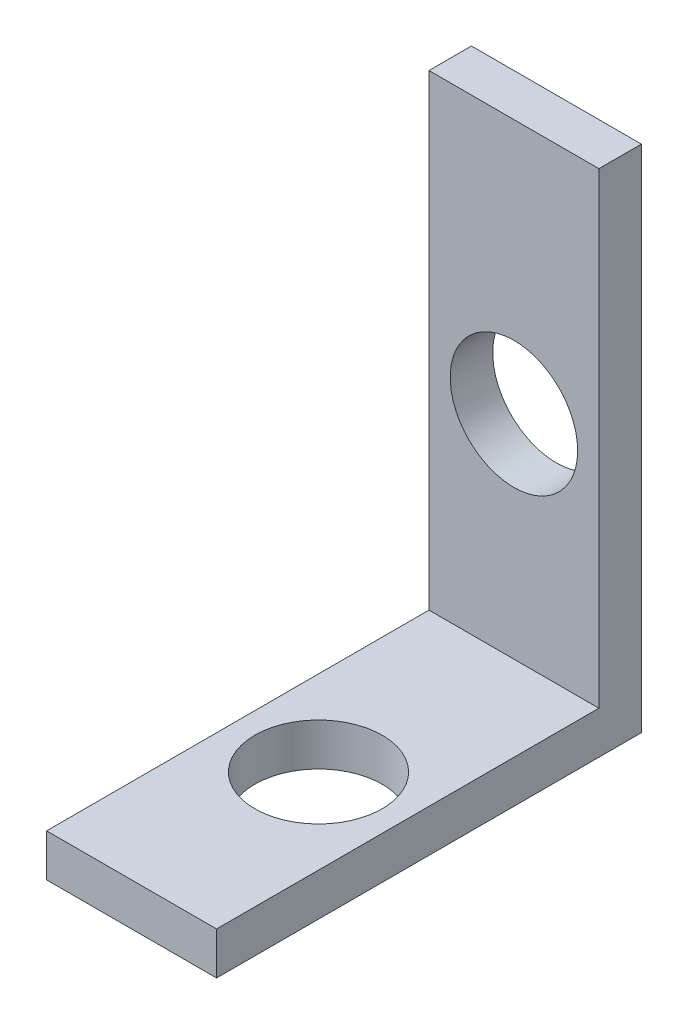
ISO-10303-21;
HEADER;
FILE_DESCRIPTION(('STEP AP214'),'2;1');
FILE_NAME('part.step','',(''),(''),'','','');
FILE_SCHEMA(('AUTOMOTIVE_DESIGN { 1 0 10303 214 1 1 1 1 }'));
ENDSEC;
DATA;
#1=APPLICATION_CONTEXT('core data for automotive mechanical design processes');
#2=APPLICATION_PROTOCOL_DEFINITION('international standard','automotive_design',2000,#1);
#3=PRODUCT_CONTEXT('',#1,'mechanical');
#4=PRODUCT('Part','Part','',(#3));
#5=PRODUCT_RELATED_PRODUCT_CATEGORY('part','',(#4));
#6=PRODUCT_DEFINITION_FORMATION('','',#4);
#7=PRODUCT_DEFINITION_CONTEXT('part definition',#1,'design');
#8=PRODUCT_DEFINITION('design','',#6,#7);
#9=PRODUCT_DEFINITION_SHAPE('','',#8);
#10=(LENGTH_UNIT() NAMED_UNIT(*) SI_UNIT(.MILLI.,.METRE.));
#11=(NAMED_UNIT(*) PLANE_ANGLE_UNIT() SI_UNIT($,.RADIAN.));
#12=(NAMED_UNIT(*) SI_UNIT($,.STERADIAN.) SOLID_ANGLE_UNIT());
#13=UNCERTAINTY_MEASURE_WITH_UNIT(LENGTH_MEASURE(1.E-05),#10,'distance_accuracy_value','');
#14=(GEOMETRIC_REPRESENTATION_CONTEXT(3) GLOBAL_UNCERTAINTY_ASSIGNED_CONTEXT((#13)) GLOBAL_UNIT_ASSIGNED_CONTEXT((#10,
#11,#12)) REPRESENTATION_CONTEXT('',''));
#15=CARTESIAN_POINT('',(0.,0.,0.));
#16=DIRECTION('',(0.,0.,1.));
#17=DIRECTION('',(1.,0.,0.));
#18=AXIS2_PLACEMENT_3D('',#15,#16,#17);
#19=CARTESIAN_POINT('',(-2.,-0.500000000000001,10.));
#20=DIRECTION('',(0.,0.,1.));
#21=DIRECTION('',(1.,0.,0.));
#22=AXIS2_PLACEMENT_3D('',#19,#20,#21);
#23=PLANE('',#22);
#24=DIRECTION('',(0.,-1.,0.));
#25=VECTOR('',#24,1.);
#26=CARTESIAN_POINT('',(2.,-0.500000000000001,10.));
#27=LINE('',#26,#25);
#28=CARTESIAN_POINT('',(2.,0.499999999999999,10.));
#29=VERTEX_POINT('',#28);
#30=CARTESIAN_POINT('',(2.,-0.500000000000001,10.));
#31=VERTEX_POINT('',#30);
#32=EDGE_CURVE('E11',#29,#31,#27,.T.);
#33=ORIENTED_EDGE('',*,*,#32,.F.);
#34=DIRECTION('',(-1.,0.,0.));
#35=VECTOR('',#34,1.);
#36=CARTESIAN_POINT('',(-2.,0.499999999999999,10.));
#37=LINE('',#36,#35);
#38=CARTESIAN_POINT('',(-2.,0.499999999999999,10.));
#39=VERTEX_POINT('',#38);
#40=EDGE_CURVE('E120',#39,#29,#37,.F.);
#41=ORIENTED_EDGE('',*,*,#40,.F.);
#42=DIRECTION('',(0.,-1.,0.));
#43=VECTOR('',#42,1.);
#44=CARTESIAN_POINT('',(-2.,-0.500000000000001,10.));
#45=LINE('',#44,#43);
#46=CARTESIAN_POINT('',(-2.,-0.500000000000001,10.));
#47=VERTEX_POINT('',#46);
#48=EDGE_CURVE('E51',#39,#47,#45,.T.);
#49=ORIENTED_EDGE('',*,*,#48,.T.);
#50=DIRECTION('',(1.,0.,0.));
#51=VECTOR('',#50,1.);
#52=CARTESIAN_POINT('',(-2.,-0.500000000000001,10.));
#53=LINE('',#52,#51);
#54=EDGE_CURVE('E110',#47,#31,#53,.T.);
#55=ORIENTED_EDGE('',*,*,#54,.T.);
#56=EDGE_LOOP('',(#33,#41,#49,#55));
#57=FACE_BOUND('',#56,.T.);
#58=ADVANCED_FACE('F42',(#57),#23,.T.);
#59=CARTESIAN_POINT('',(-2.,-0.500000000000001,10.));
#60=DIRECTION('',(1.,0.,0.));
#61=DIRECTION('',(0.,0.,-1.));
#62=AXIS2_PLACEMENT_3D('',#59,#60,#61);
#63=PLANE('',#62);
#64=ORIENTED_EDGE('',*,*,#48,.F.);
#65=DIRECTION('',(0.,0.,1.));
#66=VECTOR('',#65,1.);
#67=CARTESIAN_POINT('',(-2.,0.499999999999999,10.));
#68=LINE('',#67,#66);
#69=CARTESIAN_POINT('',(-2.,0.499999999999999,0.999999999999999));
#70=VERTEX_POINT('',#69);
#71=EDGE_CURVE('E118',#39,#70,#68,.F.);
#72=ORIENTED_EDGE('',*,*,#71,.T.);
#73=DIRECTION('',(0.,-1.,0.));
#74=VECTOR('',#73,1.);
#75=CARTESIAN_POINT('',(-2.,11.5,1.));
#76=LINE('',#75,#74);
#77=CARTESIAN_POINT('',(-2.,11.5,1.));
#78=VERTEX_POINT('',#77);
#79=EDGE_CURVE('E123',#78,#70,#76,.T.);
#80=ORIENTED_EDGE('',*,*,#79,.F.);
#81=DIRECTION('',(0.,0.,1.));
#82=VECTOR('',#81,1.);
#83=CARTESIAN_POINT('',(-2.,11.5,0.));
#84=LINE('',#83,#82);
#85=CARTESIAN_POINT('',(-2.,11.5,0.));
#86=VERTEX_POINT('',#85);
#87=EDGE_CURVE('E140',#86,#78,#84,.T.);
#88=ORIENTED_EDGE('',*,*,#87,.F.);
#89=DIRECTION('',(0.,-1.,0.));
#90=VECTOR('',#89,1.);
#91=CARTESIAN_POINT('',(-2.,-0.500000000000001,0.));
#92=LINE('',#91,#90);
#93=CARTESIAN_POINT('',(-2.,-0.500000000000001,0.));
#94=VERTEX_POINT('',#93);
#95=EDGE_CURVE('E67',#86,#94,#92,.T.);
#96=ORIENTED_EDGE('',*,*,#95,.T.);
#97=DIRECTION('',(0.,0.,-1.));
#98=VECTOR('',#97,1.);
#99=CARTESIAN_POINT('',(-2.,-0.500000000000001,10.));
#100=LINE('',#99,#98);
#101=EDGE_CURVE('E113',#47,#94,#100,.T.);
#102=ORIENTED_EDGE('',*,*,#101,.F.);
#103=EDGE_LOOP('',(#64,#72,#80,#88,#96,#102));
#104=FACE_BOUND('',#103,.T.);
#105=ADVANCED_FACE('F151',(#104),#63,.F.);
#106=CARTESIAN_POINT('',(-2.,-0.500000000000001,0.));
#107=DIRECTION('',(0.,0.,1.));
#108=DIRECTION('',(1.,0.,0.));
#109=AXIS2_PLACEMENT_3D('',#106,#107,#108);
#110=PLANE('',#109);
#111=CARTESIAN_POINT('',(0.,5.5,0.));
#112=DIRECTION('',(0.,0.,1.));
#113=DIRECTION('',(1.,0.,0.));
#114=AXIS2_PLACEMENT_3D('',#111,#112,#113);
#115=CIRCLE('',#114,1.5);
#116=CARTESIAN_POINT('',(1.5,5.5,0.));
#117=VERTEX_POINT('',#116);
#118=EDGE_CURVE('E180',#117,#117,#115,.F.);
#119=ORIENTED_EDGE('',*,*,#118,.F.);
#120=EDGE_LOOP('',(#119));
#121=FACE_BOUND('',#120,.T.);
#122=ORIENTED_EDGE('',*,*,#95,.F.);
#123=DIRECTION('',(-1.,0.,0.));
#124=VECTOR('',#123,1.);
#125=CARTESIAN_POINT('',(-2.,11.5,0.));
#126=LINE('',#125,#124);
#127=CARTESIAN_POINT('',(2.,11.5,0.));
#128=VERTEX_POINT('',#127);
#129=EDGE_CURVE('E126',#128,#86,#126,.T.);
#130=ORIENTED_EDGE('',*,*,#129,.F.);
#131=DIRECTION('',(0.,-1.,0.));
#132=VECTOR('',#131,1.);
#133=CARTESIAN_POINT('',(2.,-0.500000000000001,0.));
#134=LINE('',#133,#132);
#135=CARTESIAN_POINT('',(2.,-0.500000000000001,0.));
#136=VERTEX_POINT('',#135);
#137=EDGE_CURVE('E46',#128,#136,#134,.T.);
#138=ORIENTED_EDGE('',*,*,#137,.T.);
#139=DIRECTION('',(1.,0.,0.));
#140=VECTOR('',#139,1.);
#141=CARTESIAN_POINT('',(-2.,-0.500000000000001,0.));
#142=LINE('',#141,#140);
#143=EDGE_CURVE('E111',#94,#136,#142,.T.);
#144=ORIENTED_EDGE('',*,*,#143,.F.);
#145=EDGE_LOOP('',(#122,#130,#138,#144));
#146=FACE_BOUND('',#145,.T.);
#147=ADVANCED_FACE('F125',(#121,#146),#110,.F.);
#148=CARTESIAN_POINT('',(2.,-0.500000000000001,10.));
#149=DIRECTION('',(1.,0.,0.));
#150=DIRECTION('',(0.,0.,-1.));
#151=AXIS2_PLACEMENT_3D('',#148,#149,#150);
#152=PLANE('',#151);
#153=DIRECTION('',(0.,0.,1.));
#154=VECTOR('',#153,1.);
#155=CARTESIAN_POINT('',(2.,0.499999999999999,10.));
#156=LINE('',#155,#154);
#157=CARTESIAN_POINT('',(2.,0.499999999999999,1.));
#158=VERTEX_POINT('',#157);
#159=EDGE_CURVE('E104',#29,#158,#156,.F.);
#160=ORIENTED_EDGE('',*,*,#159,.F.);
#161=ORIENTED_EDGE('',*,*,#32,.T.);
#162=DIRECTION('',(0.,0.,-1.));
#163=VECTOR('',#162,1.);
#164=CARTESIAN_POINT('',(2.,-0.500000000000001,10.));
#165=LINE('',#164,#163);
#166=EDGE_CURVE('E102',#31,#136,#165,.T.);
#167=ORIENTED_EDGE('',*,*,#166,.T.);
#168=ORIENTED_EDGE('',*,*,#137,.F.);
#169=DIRECTION('',(0.,0.,-1.));
#170=VECTOR('',#169,1.);
#171=CARTESIAN_POINT('',(2.,11.5,0.));
#172=LINE('',#171,#170);
#173=CARTESIAN_POINT('',(2.,11.5,1.));
#174=VERTEX_POINT('',#173);
#175=EDGE_CURVE('E129',#174,#128,#172,.T.);
#176=ORIENTED_EDGE('',*,*,#175,.F.);
#177=DIRECTION('',(0.,-1.,0.));
#178=VECTOR('',#177,1.);
#179=CARTESIAN_POINT('',(2.,11.5,1.));
#180=LINE('',#179,#178);
#181=EDGE_CURVE('E138',#174,#158,#180,.T.);
#182=ORIENTED_EDGE('',*,*,#181,.T.);
#183=EDGE_LOOP('',(#160,#161,#167,#168,#176,#182));
#184=FACE_BOUND('',#183,.T.);
#185=ADVANCED_FACE('F44',(#184),#152,.T.);
#186=CARTESIAN_POINT('',(-2.,-0.500000000000001,10.));
#187=DIRECTION('',(0.,1.,0.));
#188=DIRECTION('',(-1.,0.,0.));
#189=AXIS2_PLACEMENT_3D('',#186,#187,#188);
#190=PLANE('',#189);
#191=CARTESIAN_POINT('',(0.,-0.5,5.6));
#192=DIRECTION('',(0.,1.,0.));
#193=DIRECTION('',(-1.,0.,0.));
#194=AXIS2_PLACEMENT_3D('',#191,#192,#193);
#195=CIRCLE('',#194,1.5);
#196=CARTESIAN_POINT('',(-1.5,-0.5,5.6));
#197=VERTEX_POINT('',#196);
#198=EDGE_CURVE('E145',#197,#197,#195,.T.);
#199=ORIENTED_EDGE('',*,*,#198,.T.);
#200=EDGE_LOOP('',(#199));
#201=FACE_BOUND('',#200,.T.);
#202=ORIENTED_EDGE('',*,*,#143,.T.);
#203=ORIENTED_EDGE('',*,*,#166,.F.);
#204=ORIENTED_EDGE('',*,*,#54,.F.);
#205=ORIENTED_EDGE('',*,*,#101,.T.);
#206=EDGE_LOOP('',(#202,#203,#204,#205));
#207=FACE_BOUND('',#206,.T.);
#208=ADVANCED_FACE('F108',(#201,#207),#190,.F.);
#209=CARTESIAN_POINT('',(-2.,0.499999999999999,10.));
#210=DIRECTION('',(0.,1.,0.));
#211=DIRECTION('',(-1.,0.,0.));
#212=AXIS2_PLACEMENT_3D('',#209,#210,#211);
#213=PLANE('',#212);
#214=CARTESIAN_POINT('',(0.,0.499999999999999,5.6));
#215=DIRECTION('',(0.,1.,0.));
#216=DIRECTION('',(-1.,0.,0.));
#217=AXIS2_PLACEMENT_3D('',#214,#215,#216);
#218=CIRCLE('',#217,1.5);
#219=CARTESIAN_POINT('',(-1.5,0.499999999999999,5.6));
#220=VERTEX_POINT('',#219);
#221=EDGE_CURVE('E182',#220,#220,#218,.T.);
#222=ORIENTED_EDGE('',*,*,#221,.F.);
#223=EDGE_LOOP('',(#222));
#224=FACE_BOUND('',#223,.T.);
#225=DIRECTION('',(1.,0.,0.));
#226=VECTOR('',#225,1.);
#227=CARTESIAN_POINT('',(-2.,0.499999999999999,1.));
#228=LINE('',#227,#226);
#229=EDGE_CURVE('E58',#70,#158,#228,.T.);
#230=ORIENTED_EDGE('',*,*,#229,.F.);
#231=ORIENTED_EDGE('',*,*,#71,.F.);
#232=ORIENTED_EDGE('',*,*,#40,.T.);
#233=ORIENTED_EDGE('',*,*,#159,.T.);
#234=EDGE_LOOP('',(#230,#231,#232,#233));
#235=FACE_BOUND('',#234,.T.);
#236=ADVANCED_FACE('F153',(#224,#235),#213,.T.);
#237=CARTESIAN_POINT('',(-2.,11.5,1.));
#238=DIRECTION('',(0.,0.,-1.));
#239=DIRECTION('',(-1.,0.,0.));
#240=AXIS2_PLACEMENT_3D('',#237,#238,#239);
#241=PLANE('',#240);
#242=CARTESIAN_POINT('',(0.,5.5,1.));
#243=DIRECTION('',(0.,0.,1.));
#244=DIRECTION('',(1.,0.,0.));
#245=AXIS2_PLACEMENT_3D('',#242,#243,#244);
#246=CIRCLE('',#245,1.5);
#247=CARTESIAN_POINT('',(1.5,5.5,1.));
#248=VERTEX_POINT('',#247);
#249=EDGE_CURVE('E183',#248,#248,#246,.T.);
#250=ORIENTED_EDGE('',*,*,#249,.F.);
#251=EDGE_LOOP('',(#250));
#252=FACE_BOUND('',#251,.T.);
#253=ORIENTED_EDGE('',*,*,#229,.T.);
#254=ORIENTED_EDGE('',*,*,#181,.F.);
#255=DIRECTION('',(1.,0.,0.));
#256=VECTOR('',#255,1.);
#257=CARTESIAN_POINT('',(-2.,11.5,1.));
#258=LINE('',#257,#256);
#259=EDGE_CURVE('E135',#78,#174,#258,.T.);
#260=ORIENTED_EDGE('',*,*,#259,.F.);
#261=ORIENTED_EDGE('',*,*,#79,.T.);
#262=EDGE_LOOP('',(#253,#254,#260,#261));
#263=FACE_BOUND('',#262,.T.);
#264=ADVANCED_FACE('F150',(#252,#263),#241,.F.);
#265=CARTESIAN_POINT('',(0.,11.5,0.));
#266=DIRECTION('',(0.,1.,0.));
#267=DIRECTION('',(-1.,0.,0.));
#268=AXIS2_PLACEMENT_3D('',#265,#266,#267);
#269=PLANE('',#268);
#270=ORIENTED_EDGE('',*,*,#87,.T.);
#271=ORIENTED_EDGE('',*,*,#259,.T.);
#272=ORIENTED_EDGE('',*,*,#175,.T.);
#273=ORIENTED_EDGE('',*,*,#129,.T.);
#274=EDGE_LOOP('',(#270,#271,#272,#273));
#275=FACE_BOUND('',#274,.T.);
#276=ADVANCED_FACE('F133',(#275),#269,.T.);
#277=CARTESIAN_POINT('',(0.,-9.5,5.6));
#278=DIRECTION('',(0.,1.,0.));
#279=DIRECTION('',(-1.,0.,0.));
#280=AXIS2_PLACEMENT_3D('',#277,#278,#279);
#281=CYLINDRICAL_SURFACE('',#280,1.5);
#282=ORIENTED_EDGE('',*,*,#221,.T.);
#283=EDGE_LOOP('',(#282));
#284=FACE_BOUND('',#283,.T.);
#285=ORIENTED_EDGE('',*,*,#198,.F.);
#286=EDGE_LOOP('',(#285));
#287=FACE_BOUND('',#286,.T.);
#288=ADVANCED_FACE('F193',(#284,#287),#281,.F.);
#289=CARTESIAN_POINT('',(0.,5.5,-9.));
#290=DIRECTION('',(0.,0.,1.));
#291=DIRECTION('',(1.,0.,0.));
#292=AXIS2_PLACEMENT_3D('',#289,#290,#291);
#293=CYLINDRICAL_SURFACE('',#292,1.5);
#294=ORIENTED_EDGE('',*,*,#118,.T.);
#295=EDGE_LOOP('',(#294));
#296=FACE_BOUND('',#295,.T.);
#297=ORIENTED_EDGE('',*,*,#249,.T.);
#298=EDGE_LOOP('',(#297));
#299=FACE_BOUND('',#298,.T.);
#300=ADVANCED_FACE('F195',(#296,#299),#293,.F.);
#301=CLOSED_SHELL('',(#58,#105,#147,#185,#208,#236,#264,#276,#288,#300));
#302=MANIFOLD_SOLID_BREP('B2',#301);
#303=ADVANCED_BREP_SHAPE_REPRESENTATION('',(#18,#302),#14);
#304=SHAPE_DEFINITION_REPRESENTATION(#9,#303);
ENDSEC;
END-ISO-10303-21;
